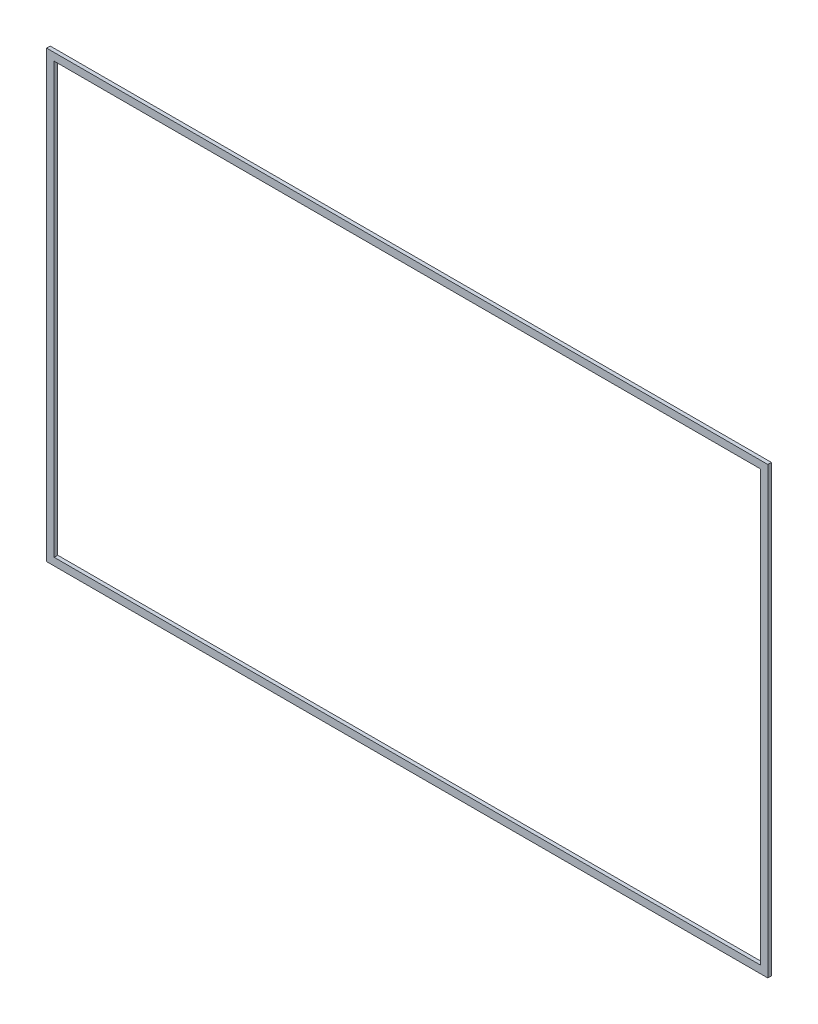
ISO-10303-21;
HEADER;
FILE_DESCRIPTION(('STEP AP214'),'2;1');
FILE_NAME('part.step','',(''),(''),'','','');
FILE_SCHEMA(('AUTOMOTIVE_DESIGN { 1 0 10303 214 1 1 1 1 }'));
ENDSEC;
DATA;
#1=APPLICATION_CONTEXT('core data for automotive mechanical design processes');
#2=APPLICATION_PROTOCOL_DEFINITION('international standard','automotive_design',2000,#1);
#3=PRODUCT_CONTEXT('',#1,'mechanical');
#4=PRODUCT('Part','Part','',(#3));
#5=PRODUCT_RELATED_PRODUCT_CATEGORY('part','',(#4));
#6=PRODUCT_DEFINITION_FORMATION('','',#4);
#7=PRODUCT_DEFINITION_CONTEXT('part definition',#1,'design');
#8=PRODUCT_DEFINITION('design','',#6,#7);
#9=PRODUCT_DEFINITION_SHAPE('','',#8);
#10=(LENGTH_UNIT() NAMED_UNIT(*) SI_UNIT(.MILLI.,.METRE.));
#11=(NAMED_UNIT(*) PLANE_ANGLE_UNIT() SI_UNIT($,.RADIAN.));
#12=(NAMED_UNIT(*) SI_UNIT($,.STERADIAN.) SOLID_ANGLE_UNIT());
#13=UNCERTAINTY_MEASURE_WITH_UNIT(LENGTH_MEASURE(1.E-05),#10,'distance_accuracy_value','');
#14=(GEOMETRIC_REPRESENTATION_CONTEXT(3) GLOBAL_UNCERTAINTY_ASSIGNED_CONTEXT((#13)) GLOBAL_UNIT_ASSIGNED_CONTEXT((#10,
#11,#12)) REPRESENTATION_CONTEXT('',''));
#15=CARTESIAN_POINT('',(0.,0.,0.));
#16=DIRECTION('',(0.,0.,1.));
#17=DIRECTION('',(1.,0.,0.));
#18=AXIS2_PLACEMENT_3D('',#15,#16,#17);
#19=CARTESIAN_POINT('',(120.,-74.,-1.2));
#20=DIRECTION('',(1.,0.,0.));
#21=DIRECTION('',(0.,0.,-1.));
#22=AXIS2_PLACEMENT_3D('',#19,#20,#21);
#23=PLANE('',#22);
#24=DIRECTION('',(0.,1.,0.));
#25=VECTOR('',#24,1.);
#26=CARTESIAN_POINT('',(120.,-74.,0.));
#27=LINE('',#26,#25);
#28=CARTESIAN_POINT('',(120.,-74.,0.));
#29=VERTEX_POINT('',#28);
#30=CARTESIAN_POINT('',(120.,74.,0.));
#31=VERTEX_POINT('',#30);
#32=EDGE_CURVE('E154',#29,#31,#27,.T.);
#33=ORIENTED_EDGE('',*,*,#32,.F.);
#34=DIRECTION('',(0.,0.,1.));
#35=VECTOR('',#34,1.);
#36=CARTESIAN_POINT('',(120.,-74.,-1.2));
#37=LINE('',#36,#35);
#38=CARTESIAN_POINT('',(120.,-74.,-1.2));
#39=VERTEX_POINT('',#38);
#40=EDGE_CURVE('E11',#39,#29,#37,.T.);
#41=ORIENTED_EDGE('',*,*,#40,.F.);
#42=DIRECTION('',(0.,1.,0.));
#43=VECTOR('',#42,1.);
#44=CARTESIAN_POINT('',(120.,-74.,-1.2));
#45=LINE('',#44,#43);
#46=CARTESIAN_POINT('',(120.,74.,-1.2));
#47=VERTEX_POINT('',#46);
#48=EDGE_CURVE('E160',#39,#47,#45,.T.);
#49=ORIENTED_EDGE('',*,*,#48,.T.);
#50=DIRECTION('',(0.,0.,1.));
#51=VECTOR('',#50,1.);
#52=CARTESIAN_POINT('',(120.,74.,-1.2));
#53=LINE('',#52,#51);
#54=EDGE_CURVE('E48',#47,#31,#53,.T.);
#55=ORIENTED_EDGE('',*,*,#54,.T.);
#56=EDGE_LOOP('',(#33,#41,#49,#55));
#57=FACE_BOUND('',#56,.T.);
#58=ADVANCED_FACE('F45',(#57),#23,.T.);
#59=CARTESIAN_POINT('',(-120.,-74.,-1.2));
#60=DIRECTION('',(0.,-1.,0.));
#61=DIRECTION('',(0.,0.,-1.));
#62=AXIS2_PLACEMENT_3D('',#59,#60,#61);
#63=PLANE('',#62);
#64=DIRECTION('',(1.,0.,0.));
#65=VECTOR('',#64,1.);
#66=CARTESIAN_POINT('',(-120.,-74.,0.));
#67=LINE('',#66,#65);
#68=CARTESIAN_POINT('',(-120.,-74.,0.));
#69=VERTEX_POINT('',#68);
#70=EDGE_CURVE('E165',#69,#29,#67,.T.);
#71=ORIENTED_EDGE('',*,*,#70,.F.);
#72=DIRECTION('',(0.,0.,1.));
#73=VECTOR('',#72,1.);
#74=CARTESIAN_POINT('',(-120.,-74.,-1.2));
#75=LINE('',#74,#73);
#76=CARTESIAN_POINT('',(-120.,-74.,-1.2));
#77=VERTEX_POINT('',#76);
#78=EDGE_CURVE('E54',#77,#69,#75,.T.);
#79=ORIENTED_EDGE('',*,*,#78,.F.);
#80=DIRECTION('',(1.,0.,0.));
#81=VECTOR('',#80,1.);
#82=CARTESIAN_POINT('',(-120.,-74.,-1.2));
#83=LINE('',#82,#81);
#84=EDGE_CURVE('E173',#77,#39,#83,.T.);
#85=ORIENTED_EDGE('',*,*,#84,.T.);
#86=ORIENTED_EDGE('',*,*,#40,.T.);
#87=EDGE_LOOP('',(#71,#79,#85,#86));
#88=FACE_BOUND('',#87,.T.);
#89=ADVANCED_FACE('F207',(#88),#63,.T.);
#90=CARTESIAN_POINT('',(-120.,-74.,-1.2));
#91=DIRECTION('',(-1.,0.,0.));
#92=DIRECTION('',(0.,0.,1.));
#93=AXIS2_PLACEMENT_3D('',#90,#91,#92);
#94=PLANE('',#93);
#95=DIRECTION('',(0.,-1.,0.));
#96=VECTOR('',#95,1.);
#97=CARTESIAN_POINT('',(-120.,-74.,0.));
#98=LINE('',#97,#96);
#99=CARTESIAN_POINT('',(-120.,74.,0.));
#100=VERTEX_POINT('',#99);
#101=EDGE_CURVE('E184',#100,#69,#98,.T.);
#102=ORIENTED_EDGE('',*,*,#101,.F.);
#103=DIRECTION('',(0.,0.,1.));
#104=VECTOR('',#103,1.);
#105=CARTESIAN_POINT('',(-120.,74.,-1.2));
#106=LINE('',#105,#104);
#107=CARTESIAN_POINT('',(-120.,74.,-1.2));
#108=VERTEX_POINT('',#107);
#109=EDGE_CURVE('E192',#108,#100,#106,.T.);
#110=ORIENTED_EDGE('',*,*,#109,.F.);
#111=DIRECTION('',(0.,-1.,0.));
#112=VECTOR('',#111,1.);
#113=CARTESIAN_POINT('',(-120.,-74.,-1.2));
#114=LINE('',#113,#112);
#115=EDGE_CURVE('E169',#108,#77,#114,.T.);
#116=ORIENTED_EDGE('',*,*,#115,.T.);
#117=ORIENTED_EDGE('',*,*,#78,.T.);
#118=EDGE_LOOP('',(#102,#110,#116,#117));
#119=FACE_BOUND('',#118,.T.);
#120=ADVANCED_FACE('F211',(#119),#94,.T.);
#121=CARTESIAN_POINT('',(-120.,74.,-1.2));
#122=DIRECTION('',(0.,1.,0.));
#123=DIRECTION('',(0.,0.,1.));
#124=AXIS2_PLACEMENT_3D('',#121,#122,#123);
#125=PLANE('',#124);
#126=DIRECTION('',(-1.,0.,0.));
#127=VECTOR('',#126,1.);
#128=CARTESIAN_POINT('',(-120.,74.,0.));
#129=LINE('',#128,#127);
#130=EDGE_CURVE('E180',#31,#100,#129,.T.);
#131=ORIENTED_EDGE('',*,*,#130,.F.);
#132=ORIENTED_EDGE('',*,*,#54,.F.);
#133=DIRECTION('',(-1.,0.,0.));
#134=VECTOR('',#133,1.);
#135=CARTESIAN_POINT('',(-120.,74.,-1.2));
#136=LINE('',#135,#134);
#137=EDGE_CURVE('E164',#47,#108,#136,.T.);
#138=ORIENTED_EDGE('',*,*,#137,.T.);
#139=ORIENTED_EDGE('',*,*,#109,.T.);
#140=EDGE_LOOP('',(#131,#132,#138,#139));
#141=FACE_BOUND('',#140,.T.);
#142=ADVANCED_FACE('F202',(#141),#125,.T.);
#143=CARTESIAN_POINT('',(0.,0.,-1.2));
#144=DIRECTION('',(0.,0.,-1.));
#145=DIRECTION('',(-1.,0.,0.));
#146=AXIS2_PLACEMENT_3D('',#143,#144,#145);
#147=PLANE('',#146);
#148=DIRECTION('',(0.,-1.,0.));
#149=VECTOR('',#148,1.);
#150=CARTESIAN_POINT('',(-117.5,-71.5,-1.2));
#151=LINE('',#150,#149);
#152=CARTESIAN_POINT('',(-117.5,71.5,-1.2));
#153=VERTEX_POINT('',#152);
#154=CARTESIAN_POINT('',(-117.5,-71.5,-1.2));
#155=VERTEX_POINT('',#154);
#156=EDGE_CURVE('E113',#153,#155,#151,.T.);
#157=ORIENTED_EDGE('',*,*,#156,.T.);
#158=DIRECTION('',(1.,0.,0.));
#159=VECTOR('',#158,1.);
#160=CARTESIAN_POINT('',(-117.5,-71.5,-1.2));
#161=LINE('',#160,#159);
#162=CARTESIAN_POINT('',(117.5,-71.5,-1.2));
#163=VERTEX_POINT('',#162);
#164=EDGE_CURVE('E123',#155,#163,#161,.T.);
#165=ORIENTED_EDGE('',*,*,#164,.T.);
#166=DIRECTION('',(0.,1.,0.));
#167=VECTOR('',#166,1.);
#168=CARTESIAN_POINT('',(117.5,-71.5,-1.2));
#169=LINE('',#168,#167);
#170=CARTESIAN_POINT('',(117.5,71.5,-1.2));
#171=VERTEX_POINT('',#170);
#172=EDGE_CURVE('E62',#163,#171,#169,.T.);
#173=ORIENTED_EDGE('',*,*,#172,.T.);
#174=DIRECTION('',(-1.,0.,0.));
#175=VECTOR('',#174,1.);
#176=CARTESIAN_POINT('',(-117.5,71.5,-1.2));
#177=LINE('',#176,#175);
#178=EDGE_CURVE('E120',#171,#153,#177,.T.);
#179=ORIENTED_EDGE('',*,*,#178,.T.);
#180=EDGE_LOOP('',(#157,#165,#173,#179));
#181=FACE_BOUND('',#180,.T.);
#182=ORIENTED_EDGE('',*,*,#48,.F.);
#183=ORIENTED_EDGE('',*,*,#84,.F.);
#184=ORIENTED_EDGE('',*,*,#115,.F.);
#185=ORIENTED_EDGE('',*,*,#137,.F.);
#186=EDGE_LOOP('',(#182,#183,#184,#185));
#187=FACE_BOUND('',#186,.T.);
#188=ADVANCED_FACE('F128',(#181,#187),#147,.T.);
#189=CARTESIAN_POINT('',(0.,0.,0.));
#190=DIRECTION('',(0.,0.,-1.));
#191=DIRECTION('',(-1.,0.,0.));
#192=AXIS2_PLACEMENT_3D('',#189,#190,#191);
#193=PLANE('',#192);
#194=DIRECTION('',(1.,0.,0.));
#195=VECTOR('',#194,1.);
#196=CARTESIAN_POINT('',(-117.5,-71.5,0.));
#197=LINE('',#196,#195);
#198=CARTESIAN_POINT('',(-117.5,-71.5,0.));
#199=VERTEX_POINT('',#198);
#200=CARTESIAN_POINT('',(117.5,-71.5,0.));
#201=VERTEX_POINT('',#200);
#202=EDGE_CURVE('E145',#199,#201,#197,.T.);
#203=ORIENTED_EDGE('',*,*,#202,.F.);
#204=DIRECTION('',(0.,-1.,0.));
#205=VECTOR('',#204,1.);
#206=CARTESIAN_POINT('',(-117.5,-71.5,0.));
#207=LINE('',#206,#205);
#208=CARTESIAN_POINT('',(-117.5,71.5,0.));
#209=VERTEX_POINT('',#208);
#210=EDGE_CURVE('E70',#209,#199,#207,.T.);
#211=ORIENTED_EDGE('',*,*,#210,.F.);
#212=DIRECTION('',(-1.,0.,0.));
#213=VECTOR('',#212,1.);
#214=CARTESIAN_POINT('',(-117.5,71.5,0.));
#215=LINE('',#214,#213);
#216=CARTESIAN_POINT('',(117.5,71.5,0.));
#217=VERTEX_POINT('',#216);
#218=EDGE_CURVE('E132',#217,#209,#215,.T.);
#219=ORIENTED_EDGE('',*,*,#218,.F.);
#220=DIRECTION('',(0.,1.,0.));
#221=VECTOR('',#220,1.);
#222=CARTESIAN_POINT('',(117.5,-71.5,0.));
#223=LINE('',#222,#221);
#224=EDGE_CURVE('E136',#201,#217,#223,.T.);
#225=ORIENTED_EDGE('',*,*,#224,.F.);
#226=EDGE_LOOP('',(#203,#211,#219,#225));
#227=FACE_BOUND('',#226,.T.);
#228=ORIENTED_EDGE('',*,*,#32,.T.);
#229=ORIENTED_EDGE('',*,*,#130,.T.);
#230=ORIENTED_EDGE('',*,*,#101,.T.);
#231=ORIENTED_EDGE('',*,*,#70,.T.);
#232=EDGE_LOOP('',(#228,#229,#230,#231));
#233=FACE_BOUND('',#232,.T.);
#234=ADVANCED_FACE('F204',(#227,#233),#193,.F.);
#235=CARTESIAN_POINT('',(-117.5,-71.5,-1.2));
#236=DIRECTION('',(-1.,0.,0.));
#237=DIRECTION('',(0.,0.,1.));
#238=AXIS2_PLACEMENT_3D('',#235,#236,#237);
#239=PLANE('',#238);
#240=ORIENTED_EDGE('',*,*,#210,.T.);
#241=DIRECTION('',(0.,0.,1.));
#242=VECTOR('',#241,1.);
#243=CARTESIAN_POINT('',(-117.5,-71.5,-1.2));
#244=LINE('',#243,#242);
#245=EDGE_CURVE('E109',#155,#199,#244,.T.);
#246=ORIENTED_EDGE('',*,*,#245,.F.);
#247=ORIENTED_EDGE('',*,*,#156,.F.);
#248=DIRECTION('',(0.,0.,1.));
#249=VECTOR('',#248,1.);
#250=CARTESIAN_POINT('',(-117.5,71.5,-1.2));
#251=LINE('',#250,#249);
#252=EDGE_CURVE('E151',#153,#209,#251,.T.);
#253=ORIENTED_EDGE('',*,*,#252,.T.);
#254=EDGE_LOOP('',(#240,#246,#247,#253));
#255=FACE_BOUND('',#254,.T.);
#256=ADVANCED_FACE('F111',(#255),#239,.F.);
#257=CARTESIAN_POINT('',(-117.5,71.5,-1.2));
#258=DIRECTION('',(0.,1.,0.));
#259=DIRECTION('',(-1.,0.,0.));
#260=AXIS2_PLACEMENT_3D('',#257,#258,#259);
#261=PLANE('',#260);
#262=ORIENTED_EDGE('',*,*,#218,.T.);
#263=ORIENTED_EDGE('',*,*,#252,.F.);
#264=ORIENTED_EDGE('',*,*,#178,.F.);
#265=DIRECTION('',(0.,0.,1.));
#266=VECTOR('',#265,1.);
#267=CARTESIAN_POINT('',(117.5,71.5,-1.2));
#268=LINE('',#267,#266);
#269=EDGE_CURVE('E155',#171,#217,#268,.T.);
#270=ORIENTED_EDGE('',*,*,#269,.T.);
#271=EDGE_LOOP('',(#262,#263,#264,#270));
#272=FACE_BOUND('',#271,.T.);
#273=ADVANCED_FACE('F264',(#272),#261,.F.);
#274=CARTESIAN_POINT('',(117.5,-71.5,-1.2));
#275=DIRECTION('',(1.,0.,0.));
#276=DIRECTION('',(0.,0.,-1.));
#277=AXIS2_PLACEMENT_3D('',#274,#275,#276);
#278=PLANE('',#277);
#279=ORIENTED_EDGE('',*,*,#224,.T.);
#280=ORIENTED_EDGE('',*,*,#269,.F.);
#281=ORIENTED_EDGE('',*,*,#172,.F.);
#282=DIRECTION('',(0.,0.,1.));
#283=VECTOR('',#282,1.);
#284=CARTESIAN_POINT('',(117.5,-71.5,-1.2));
#285=LINE('',#284,#283);
#286=EDGE_CURVE('E119',#163,#201,#285,.T.);
#287=ORIENTED_EDGE('',*,*,#286,.T.);
#288=EDGE_LOOP('',(#279,#280,#281,#287));
#289=FACE_BOUND('',#288,.T.);
#290=ADVANCED_FACE('F273',(#289),#278,.F.);
#291=CARTESIAN_POINT('',(-117.5,-71.5,-1.2));
#292=DIRECTION('',(0.,-1.,0.));
#293=DIRECTION('',(0.,0.,-1.));
#294=AXIS2_PLACEMENT_3D('',#291,#292,#293);
#295=PLANE('',#294);
#296=ORIENTED_EDGE('',*,*,#202,.T.);
#297=ORIENTED_EDGE('',*,*,#286,.F.);
#298=ORIENTED_EDGE('',*,*,#164,.F.);
#299=ORIENTED_EDGE('',*,*,#245,.T.);
#300=EDGE_LOOP('',(#296,#297,#298,#299));
#301=FACE_BOUND('',#300,.T.);
#302=ADVANCED_FACE('F124',(#301),#295,.F.);
#303=CLOSED_SHELL('',(#58,#89,#120,#142,#188,#234,#256,#273,#290,#302));
#304=MANIFOLD_SOLID_BREP('B2',#303);
#305=ADVANCED_BREP_SHAPE_REPRESENTATION('',(#18,#304),#14);
#306=SHAPE_DEFINITION_REPRESENTATION(#9,#305);
ENDSEC;
END-ISO-10303-21;
